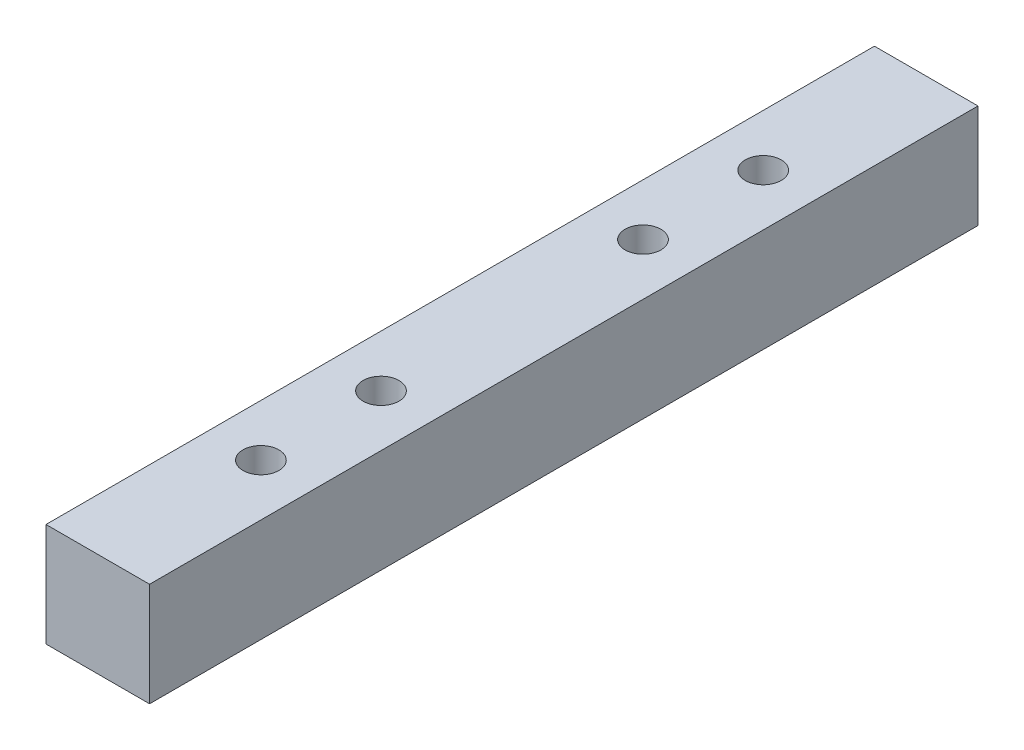
ISO-10303-21;
HEADER;
FILE_DESCRIPTION(('STEP AP214'),'2;1');
FILE_NAME('part.step','',(''),(''),'','','');
FILE_SCHEMA(('AUTOMOTIVE_DESIGN { 1 0 10303 214 1 1 1 1 }'));
ENDSEC;
DATA;
#1=APPLICATION_CONTEXT('core data for automotive mechanical design processes');
#2=APPLICATION_PROTOCOL_DEFINITION('international standard','automotive_design',2000,#1);
#3=PRODUCT_CONTEXT('',#1,'mechanical');
#4=PRODUCT('Part','Part','',(#3));
#5=PRODUCT_RELATED_PRODUCT_CATEGORY('part','',(#4));
#6=PRODUCT_DEFINITION_FORMATION('','',#4);
#7=PRODUCT_DEFINITION_CONTEXT('part definition',#1,'design');
#8=PRODUCT_DEFINITION('design','',#6,#7);
#9=PRODUCT_DEFINITION_SHAPE('','',#8);
#10=(LENGTH_UNIT() NAMED_UNIT(*) SI_UNIT(.MILLI.,.METRE.));
#11=(NAMED_UNIT(*) PLANE_ANGLE_UNIT() SI_UNIT($,.RADIAN.));
#12=(NAMED_UNIT(*) SI_UNIT($,.STERADIAN.) SOLID_ANGLE_UNIT());
#13=UNCERTAINTY_MEASURE_WITH_UNIT(LENGTH_MEASURE(1.E-05),#10,'distance_accuracy_value','');
#14=(GEOMETRIC_REPRESENTATION_CONTEXT(3) GLOBAL_UNCERTAINTY_ASSIGNED_CONTEXT((#13)) GLOBAL_UNIT_ASSIGNED_CONTEXT((#10,
#11,#12)) REPRESENTATION_CONTEXT('',''));
#15=CARTESIAN_POINT('',(0.,0.,0.));
#16=DIRECTION('',(0.,0.,1.));
#17=DIRECTION('',(1.,0.,0.));
#18=AXIS2_PLACEMENT_3D('',#15,#16,#17);
#19=CARTESIAN_POINT('',(0.,0.,120.));
#20=DIRECTION('',(1.,0.,0.));
#21=DIRECTION('',(0.,1.,0.));
#22=AXIS2_PLACEMENT_3D('',#19,#20,#21);
#23=PLANE('',#22);
#24=DIRECTION('',(0.,-1.,0.));
#25=VECTOR('',#24,1.);
#26=CARTESIAN_POINT('',(0.,0.,0.));
#27=LINE('',#26,#25);
#28=CARTESIAN_POINT('',(0.,0.,0.));
#29=VERTEX_POINT('',#28);
#30=CARTESIAN_POINT('',(0.,-15.,0.));
#31=VERTEX_POINT('',#30);
#32=EDGE_CURVE('E106',#29,#31,#27,.T.);
#33=ORIENTED_EDGE('',*,*,#32,.T.);
#34=DIRECTION('',(0.,0.,-1.));
#35=VECTOR('',#34,1.);
#36=CARTESIAN_POINT('',(0.,-15.,120.));
#37=LINE('',#36,#35);
#38=CARTESIAN_POINT('',(0.,-15.,120.));
#39=VERTEX_POINT('',#38);
#40=EDGE_CURVE('E11',#39,#31,#37,.T.);
#41=ORIENTED_EDGE('',*,*,#40,.F.);
#42=DIRECTION('',(0.,-1.,0.));
#43=VECTOR('',#42,1.);
#44=CARTESIAN_POINT('',(0.,0.,120.));
#45=LINE('',#44,#43);
#46=CARTESIAN_POINT('',(0.,0.,120.));
#47=VERTEX_POINT('',#46);
#48=EDGE_CURVE('E94',#47,#39,#45,.T.);
#49=ORIENTED_EDGE('',*,*,#48,.F.);
#50=DIRECTION('',(0.,0.,-1.));
#51=VECTOR('',#50,1.);
#52=CARTESIAN_POINT('',(0.,0.,120.));
#53=LINE('',#52,#51);
#54=EDGE_CURVE('E102',#47,#29,#53,.T.);
#55=ORIENTED_EDGE('',*,*,#54,.T.);
#56=EDGE_LOOP('',(#33,#41,#49,#55));
#57=FACE_BOUND('',#56,.T.);
#58=ADVANCED_FACE('F43',(#57),#23,.F.);
#59=CARTESIAN_POINT('',(0.,-15.,120.));
#60=DIRECTION('',(0.,1.,0.));
#61=DIRECTION('',(0.,0.,1.));
#62=AXIS2_PLACEMENT_3D('',#59,#60,#61);
#63=PLANE('',#62);
#64=CARTESIAN_POINT('',(7.5,-15.,23.61));
#65=DIRECTION('',(0.,1.,0.));
#66=DIRECTION('',(0.,0.,1.));
#67=AXIS2_PLACEMENT_3D('',#64,#65,#66);
#68=CIRCLE('',#67,2.6);
#69=CARTESIAN_POINT('',(7.5,-15.,26.21));
#70=VERTEX_POINT('',#69);
#71=EDGE_CURVE('E109',#70,#70,#68,.T.);
#72=ORIENTED_EDGE('',*,*,#71,.T.);
#73=EDGE_LOOP('',(#72));
#74=FACE_BOUND('',#73,.T.);
#75=CARTESIAN_POINT('',(7.5,-15.,96.37));
#76=DIRECTION('',(0.,1.,0.));
#77=DIRECTION('',(0.,0.,1.));
#78=AXIS2_PLACEMENT_3D('',#75,#76,#77);
#79=CIRCLE('',#78,2.60000000000001);
#80=CARTESIAN_POINT('',(7.5,-15.,98.97));
#81=VERTEX_POINT('',#80);
#82=EDGE_CURVE('E135',#81,#81,#79,.T.);
#83=ORIENTED_EDGE('',*,*,#82,.T.);
#84=EDGE_LOOP('',(#83));
#85=FACE_BOUND('',#84,.T.);
#86=CARTESIAN_POINT('',(7.5,-15.,78.975));
#87=DIRECTION('',(0.,1.,0.));
#88=DIRECTION('',(0.,0.,1.));
#89=AXIS2_PLACEMENT_3D('',#86,#87,#88);
#90=CIRCLE('',#89,2.60000000000001);
#91=CARTESIAN_POINT('',(7.5,-15.,81.575));
#92=VERTEX_POINT('',#91);
#93=EDGE_CURVE('E129',#92,#92,#90,.T.);
#94=ORIENTED_EDGE('',*,*,#93,.T.);
#95=EDGE_LOOP('',(#94));
#96=FACE_BOUND('',#95,.T.);
#97=CARTESIAN_POINT('',(7.5,-15.,41.025));
#98=DIRECTION('',(0.,1.,0.));
#99=DIRECTION('',(0.,0.,1.));
#100=AXIS2_PLACEMENT_3D('',#97,#98,#99);
#101=CIRCLE('',#100,2.59999999999999);
#102=CARTESIAN_POINT('',(7.5,-15.,43.625));
#103=VERTEX_POINT('',#102);
#104=EDGE_CURVE('E123',#103,#103,#101,.T.);
#105=ORIENTED_EDGE('',*,*,#104,.T.);
#106=EDGE_LOOP('',(#105));
#107=FACE_BOUND('',#106,.T.);
#108=DIRECTION('',(1.,0.,0.));
#109=VECTOR('',#108,1.);
#110=CARTESIAN_POINT('',(0.,-15.,0.));
#111=LINE('',#110,#109);
#112=CARTESIAN_POINT('',(15.,-15.,0.));
#113=VERTEX_POINT('',#112);
#114=EDGE_CURVE('E98',#31,#113,#111,.T.);
#115=ORIENTED_EDGE('',*,*,#114,.T.);
#116=DIRECTION('',(0.,0.,-1.));
#117=VECTOR('',#116,1.);
#118=CARTESIAN_POINT('',(15.,-15.,120.));
#119=LINE('',#118,#117);
#120=CARTESIAN_POINT('',(15.,-15.,120.));
#121=VERTEX_POINT('',#120);
#122=EDGE_CURVE('E51',#121,#113,#119,.T.);
#123=ORIENTED_EDGE('',*,*,#122,.F.);
#124=DIRECTION('',(1.,0.,0.));
#125=VECTOR('',#124,1.);
#126=CARTESIAN_POINT('',(0.,-15.,120.));
#127=LINE('',#126,#125);
#128=EDGE_CURVE('E89',#39,#121,#127,.T.);
#129=ORIENTED_EDGE('',*,*,#128,.F.);
#130=ORIENTED_EDGE('',*,*,#40,.T.);
#131=EDGE_LOOP('',(#115,#123,#129,#130));
#132=FACE_BOUND('',#131,.T.);
#133=ADVANCED_FACE('F97',(#74,#85,#96,#107,#132),#63,.F.);
#134=CARTESIAN_POINT('',(15.,0.,120.));
#135=DIRECTION('',(-1.,0.,0.));
#136=DIRECTION('',(0.,-1.,0.));
#137=AXIS2_PLACEMENT_3D('',#134,#135,#136);
#138=PLANE('',#137);
#139=DIRECTION('',(0.,1.,0.));
#140=VECTOR('',#139,1.);
#141=CARTESIAN_POINT('',(15.,0.,0.));
#142=LINE('',#141,#140);
#143=CARTESIAN_POINT('',(15.,0.,0.));
#144=VERTEX_POINT('',#143);
#145=EDGE_CURVE('E76',#113,#144,#142,.T.);
#146=ORIENTED_EDGE('',*,*,#145,.T.);
#147=DIRECTION('',(0.,0.,-1.));
#148=VECTOR('',#147,1.);
#149=CARTESIAN_POINT('',(15.,0.,120.));
#150=LINE('',#149,#148);
#151=CARTESIAN_POINT('',(15.,0.,120.));
#152=VERTEX_POINT('',#151);
#153=EDGE_CURVE('E99',#152,#144,#150,.T.);
#154=ORIENTED_EDGE('',*,*,#153,.F.);
#155=DIRECTION('',(0.,1.,0.));
#156=VECTOR('',#155,1.);
#157=CARTESIAN_POINT('',(15.,0.,120.));
#158=LINE('',#157,#156);
#159=EDGE_CURVE('E92',#121,#152,#158,.T.);
#160=ORIENTED_EDGE('',*,*,#159,.F.);
#161=ORIENTED_EDGE('',*,*,#122,.T.);
#162=EDGE_LOOP('',(#146,#154,#160,#161));
#163=FACE_BOUND('',#162,.T.);
#164=ADVANCED_FACE('F100',(#163),#138,.F.);
#165=CARTESIAN_POINT('',(0.,0.,120.));
#166=DIRECTION('',(0.,-1.,0.));
#167=DIRECTION('',(0.,0.,-1.));
#168=AXIS2_PLACEMENT_3D('',#165,#166,#167);
#169=PLANE('',#168);
#170=CARTESIAN_POINT('',(7.5,0.,23.61));
#171=DIRECTION('',(0.,1.,0.));
#172=DIRECTION('',(0.,0.,1.));
#173=AXIS2_PLACEMENT_3D('',#170,#171,#172);
#174=CIRCLE('',#173,2.6);
#175=CARTESIAN_POINT('',(7.5,0.,26.21));
#176=VERTEX_POINT('',#175);
#177=EDGE_CURVE('E138',#176,#176,#174,.T.);
#178=ORIENTED_EDGE('',*,*,#177,.F.);
#179=EDGE_LOOP('',(#178));
#180=FACE_BOUND('',#179,.T.);
#181=CARTESIAN_POINT('',(7.5,0.,96.37));
#182=DIRECTION('',(0.,1.,0.));
#183=DIRECTION('',(0.,0.,1.));
#184=AXIS2_PLACEMENT_3D('',#181,#182,#183);
#185=CIRCLE('',#184,2.60000000000001);
#186=CARTESIAN_POINT('',(7.5,0.,98.97));
#187=VERTEX_POINT('',#186);
#188=EDGE_CURVE('E132',#187,#187,#185,.T.);
#189=ORIENTED_EDGE('',*,*,#188,.F.);
#190=EDGE_LOOP('',(#189));
#191=FACE_BOUND('',#190,.T.);
#192=CARTESIAN_POINT('',(7.5,0.,78.975));
#193=DIRECTION('',(0.,1.,0.));
#194=DIRECTION('',(0.,0.,1.));
#195=AXIS2_PLACEMENT_3D('',#192,#193,#194);
#196=CIRCLE('',#195,2.60000000000001);
#197=CARTESIAN_POINT('',(7.5,0.,81.575));
#198=VERTEX_POINT('',#197);
#199=EDGE_CURVE('E126',#198,#198,#196,.T.);
#200=ORIENTED_EDGE('',*,*,#199,.F.);
#201=EDGE_LOOP('',(#200));
#202=FACE_BOUND('',#201,.T.);
#203=CARTESIAN_POINT('',(7.5,0.,41.025));
#204=DIRECTION('',(0.,1.,0.));
#205=DIRECTION('',(0.,0.,1.));
#206=AXIS2_PLACEMENT_3D('',#203,#204,#205);
#207=CIRCLE('',#206,2.59999999999999);
#208=CARTESIAN_POINT('',(7.5,0.,43.625));
#209=VERTEX_POINT('',#208);
#210=EDGE_CURVE('E120',#209,#209,#207,.T.);
#211=ORIENTED_EDGE('',*,*,#210,.F.);
#212=EDGE_LOOP('',(#211));
#213=FACE_BOUND('',#212,.T.);
#214=DIRECTION('',(-1.,0.,0.));
#215=VECTOR('',#214,1.);
#216=CARTESIAN_POINT('',(0.,0.,0.));
#217=LINE('',#216,#215);
#218=EDGE_CURVE('E82',#144,#29,#217,.T.);
#219=ORIENTED_EDGE('',*,*,#218,.T.);
#220=ORIENTED_EDGE('',*,*,#54,.F.);
#221=DIRECTION('',(-1.,0.,0.));
#222=VECTOR('',#221,1.);
#223=CARTESIAN_POINT('',(0.,0.,120.));
#224=LINE('',#223,#222);
#225=EDGE_CURVE('E59',#152,#47,#224,.T.);
#226=ORIENTED_EDGE('',*,*,#225,.F.);
#227=ORIENTED_EDGE('',*,*,#153,.T.);
#228=EDGE_LOOP('',(#219,#220,#226,#227));
#229=FACE_BOUND('',#228,.T.);
#230=ADVANCED_FACE('F114',(#180,#191,#202,#213,#229),#169,.F.);
#231=CARTESIAN_POINT('',(0.,0.,120.));
#232=DIRECTION('',(0.,0.,1.));
#233=DIRECTION('',(1.,0.,0.));
#234=AXIS2_PLACEMENT_3D('',#231,#232,#233);
#235=PLANE('',#234);
#236=ORIENTED_EDGE('',*,*,#48,.T.);
#237=ORIENTED_EDGE('',*,*,#128,.T.);
#238=ORIENTED_EDGE('',*,*,#159,.T.);
#239=ORIENTED_EDGE('',*,*,#225,.T.);
#240=EDGE_LOOP('',(#236,#237,#238,#239));
#241=FACE_BOUND('',#240,.T.);
#242=ADVANCED_FACE('F90',(#241),#235,.T.);
#243=CARTESIAN_POINT('',(0.,0.,0.));
#244=DIRECTION('',(0.,0.,1.));
#245=DIRECTION('',(1.,0.,0.));
#246=AXIS2_PLACEMENT_3D('',#243,#244,#245);
#247=PLANE('',#246);
#248=ORIENTED_EDGE('',*,*,#32,.F.);
#249=ORIENTED_EDGE('',*,*,#218,.F.);
#250=ORIENTED_EDGE('',*,*,#145,.F.);
#251=ORIENTED_EDGE('',*,*,#114,.F.);
#252=EDGE_LOOP('',(#248,#249,#250,#251));
#253=FACE_BOUND('',#252,.T.);
#254=ADVANCED_FACE('F117',(#253),#247,.F.);
#255=CARTESIAN_POINT('',(7.5,-15.,41.025));
#256=DIRECTION('',(0.,1.,0.));
#257=DIRECTION('',(0.,0.,1.));
#258=AXIS2_PLACEMENT_3D('',#255,#256,#257);
#259=CYLINDRICAL_SURFACE('',#258,2.59999999999999);
#260=ORIENTED_EDGE('',*,*,#104,.F.);
#261=EDGE_LOOP('',(#260));
#262=FACE_BOUND('',#261,.T.);
#263=ORIENTED_EDGE('',*,*,#210,.T.);
#264=EDGE_LOOP('',(#263));
#265=FACE_BOUND('',#264,.T.);
#266=ADVANCED_FACE('F162',(#262,#265),#259,.F.);
#267=CARTESIAN_POINT('',(7.5,-15.,78.975));
#268=DIRECTION('',(0.,1.,0.));
#269=DIRECTION('',(0.,0.,1.));
#270=AXIS2_PLACEMENT_3D('',#267,#268,#269);
#271=CYLINDRICAL_SURFACE('',#270,2.60000000000001);
#272=ORIENTED_EDGE('',*,*,#93,.F.);
#273=EDGE_LOOP('',(#272));
#274=FACE_BOUND('',#273,.T.);
#275=ORIENTED_EDGE('',*,*,#199,.T.);
#276=EDGE_LOOP('',(#275));
#277=FACE_BOUND('',#276,.T.);
#278=ADVANCED_FACE('F164',(#274,#277),#271,.F.);
#279=CARTESIAN_POINT('',(7.5,-15.,96.37));
#280=DIRECTION('',(0.,1.,0.));
#281=DIRECTION('',(0.,0.,1.));
#282=AXIS2_PLACEMENT_3D('',#279,#280,#281);
#283=CYLINDRICAL_SURFACE('',#282,2.60000000000001);
#284=ORIENTED_EDGE('',*,*,#82,.F.);
#285=EDGE_LOOP('',(#284));
#286=FACE_BOUND('',#285,.T.);
#287=ORIENTED_EDGE('',*,*,#188,.T.);
#288=EDGE_LOOP('',(#287));
#289=FACE_BOUND('',#288,.T.);
#290=ADVANCED_FACE('F149',(#286,#289),#283,.F.);
#291=CARTESIAN_POINT('',(7.5,-15.,23.61));
#292=DIRECTION('',(0.,1.,0.));
#293=DIRECTION('',(0.,0.,1.));
#294=AXIS2_PLACEMENT_3D('',#291,#292,#293);
#295=CYLINDRICAL_SURFACE('',#294,2.6);
#296=ORIENTED_EDGE('',*,*,#71,.F.);
#297=EDGE_LOOP('',(#296));
#298=FACE_BOUND('',#297,.T.);
#299=ORIENTED_EDGE('',*,*,#177,.T.);
#300=EDGE_LOOP('',(#299));
#301=FACE_BOUND('',#300,.T.);
#302=ADVANCED_FACE('F146',(#298,#301),#295,.F.);
#303=CLOSED_SHELL('',(#58,#133,#164,#230,#242,#254,#266,#278,#290,#302));
#304=MANIFOLD_SOLID_BREP('B2',#303);
#305=ADVANCED_BREP_SHAPE_REPRESENTATION('',(#18,#304),#14);
#306=SHAPE_DEFINITION_REPRESENTATION(#9,#305);
ENDSEC;
END-ISO-10303-21;
